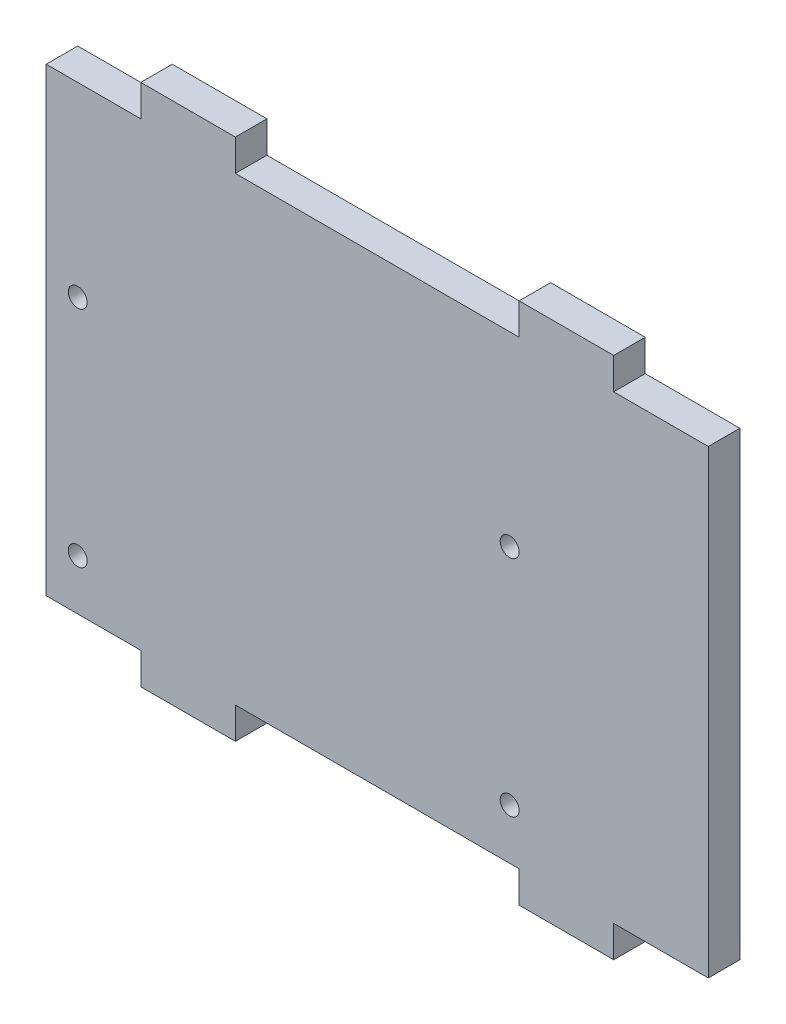
ISO-10303-21;
HEADER;
FILE_DESCRIPTION(('STEP AP214'),'2;1');
FILE_NAME('part.step','',(''),(''),'','','');
FILE_SCHEMA(('AUTOMOTIVE_DESIGN { 1 0 10303 214 1 1 1 1 }'));
ENDSEC;
DATA;
#1=APPLICATION_CONTEXT('core data for automotive mechanical design processes');
#2=APPLICATION_PROTOCOL_DEFINITION('international standard','automotive_design',2000,#1);
#3=PRODUCT_CONTEXT('',#1,'mechanical');
#4=PRODUCT('Part','Part','',(#3));
#5=PRODUCT_RELATED_PRODUCT_CATEGORY('part','',(#4));
#6=PRODUCT_DEFINITION_FORMATION('','',#4);
#7=PRODUCT_DEFINITION_CONTEXT('part definition',#1,'design');
#8=PRODUCT_DEFINITION('design','',#6,#7);
#9=PRODUCT_DEFINITION_SHAPE('','',#8);
#10=(LENGTH_UNIT() NAMED_UNIT(*) SI_UNIT(.MILLI.,.METRE.));
#11=(NAMED_UNIT(*) PLANE_ANGLE_UNIT() SI_UNIT($,.RADIAN.));
#12=(NAMED_UNIT(*) SI_UNIT($,.STERADIAN.) SOLID_ANGLE_UNIT());
#13=UNCERTAINTY_MEASURE_WITH_UNIT(LENGTH_MEASURE(1.E-05),#10,'distance_accuracy_value','');
#14=(GEOMETRIC_REPRESENTATION_CONTEXT(3) GLOBAL_UNCERTAINTY_ASSIGNED_CONTEXT((#13)) GLOBAL_UNIT_ASSIGNED_CONTEXT((#10,
#11,#12)) REPRESENTATION_CONTEXT('',''));
#15=CARTESIAN_POINT('',(0.,0.,0.));
#16=DIRECTION('',(0.,0.,1.));
#17=DIRECTION('',(1.,0.,0.));
#18=AXIS2_PLACEMENT_3D('',#15,#16,#17);
#19=CARTESIAN_POINT('',(-174.858209676586,152.05914501331,5.));
#20=DIRECTION('',(0.,-1.,0.));
#21=DIRECTION('',(0.,0.,-1.));
#22=AXIS2_PLACEMENT_3D('',#19,#20,#21);
#23=PLANE('',#22);
#24=DIRECTION('',(-1.,0.,0.));
#25=VECTOR('',#24,1.);
#26=CARTESIAN_POINT('',(-174.858209676586,152.05914501331,5.));
#27=LINE('',#26,#25);
#28=CARTESIAN_POINT('',(-159.858209676586,152.05914501331,5.));
#29=VERTEX_POINT('',#28);
#30=CARTESIAN_POINT('',(-174.858209676586,152.05914501331,5.));
#31=VERTEX_POINT('',#30);
#32=EDGE_CURVE('E37',#29,#31,#27,.T.);
#33=ORIENTED_EDGE('',*,*,#32,.F.);
#34=DIRECTION('',(0.,0.,1.));
#35=VECTOR('',#34,1.);
#36=CARTESIAN_POINT('',(-159.858209676586,152.05914501331,0.));
#37=LINE('',#36,#35);
#38=CARTESIAN_POINT('',(-159.858209676586,152.05914501331,0.));
#39=VERTEX_POINT('',#38);
#40=EDGE_CURVE('E206',#39,#29,#37,.T.);
#41=ORIENTED_EDGE('',*,*,#40,.F.);
#42=DIRECTION('',(-1.,0.,0.));
#43=VECTOR('',#42,1.);
#44=CARTESIAN_POINT('',(-174.858209676586,152.05914501331,0.));
#45=LINE('',#44,#43);
#46=CARTESIAN_POINT('',(-174.858209676586,152.05914501331,0.));
#47=VERTEX_POINT('',#46);
#48=EDGE_CURVE('E238',#39,#47,#45,.T.);
#49=ORIENTED_EDGE('',*,*,#48,.T.);
#50=DIRECTION('',(0.,0.,-1.));
#51=VECTOR('',#50,1.);
#52=CARTESIAN_POINT('',(-174.858209676586,152.05914501331,5.));
#53=LINE('',#52,#51);
#54=EDGE_CURVE('E246',#31,#47,#53,.T.);
#55=ORIENTED_EDGE('',*,*,#54,.F.);
#56=EDGE_LOOP('',(#33,#41,#49,#55));
#57=FACE_BOUND('',#56,.T.);
#58=ADVANCED_FACE('F33',(#57),#23,.F.);
#59=CARTESIAN_POINT('',(-99.8582096765858,152.05914501331,0.));
#60=VERTEX_POINT('',#59);
#61=CARTESIAN_POINT('',(-144.858209676586,152.05914501331,0.));
#62=VERTEX_POINT('',#61);
#63=EDGE_CURVE('E240',#60,#62,#45,.T.);
#64=ORIENTED_EDGE('',*,*,#63,.T.);
#65=DIRECTION('',(0.,0.,1.));
#66=VECTOR('',#65,1.);
#67=CARTESIAN_POINT('',(-144.858209676586,152.05914501331,0.));
#68=LINE('',#67,#66);
#69=CARTESIAN_POINT('',(-144.858209676586,152.05914501331,5.));
#70=VERTEX_POINT('',#69);
#71=EDGE_CURVE('E58',#62,#70,#68,.T.);
#72=ORIENTED_EDGE('',*,*,#71,.T.);
#73=CARTESIAN_POINT('',(-99.8582096765858,152.05914501331,5.));
#74=VERTEX_POINT('',#73);
#75=EDGE_CURVE('E290',#74,#70,#27,.T.);
#76=ORIENTED_EDGE('',*,*,#75,.F.);
#77=DIRECTION('',(0.,0.,1.));
#78=VECTOR('',#77,1.);
#79=CARTESIAN_POINT('',(-99.8582096765858,152.05914501331,0.));
#80=LINE('',#79,#78);
#81=EDGE_CURVE('E225',#60,#74,#80,.T.);
#82=ORIENTED_EDGE('',*,*,#81,.F.);
#83=EDGE_LOOP('',(#64,#72,#76,#82));
#84=FACE_BOUND('',#83,.T.);
#85=ADVANCED_FACE('F435',(#84),#23,.F.);
#86=CARTESIAN_POINT('',(-174.858209676586,79.0591450133095,5.));
#87=DIRECTION('',(0.,1.,0.));
#88=DIRECTION('',(0.,0.,1.));
#89=AXIS2_PLACEMENT_3D('',#86,#87,#88);
#90=PLANE('',#89);
#91=DIRECTION('',(1.,0.,0.));
#92=VECTOR('',#91,1.);
#93=CARTESIAN_POINT('',(-174.858209676586,79.0591450133095,0.));
#94=LINE('',#93,#92);
#95=CARTESIAN_POINT('',(-144.858209676586,79.0591450133095,0.));
#96=VERTEX_POINT('',#95);
#97=CARTESIAN_POINT('',(-99.8582096765858,79.0591450133095,0.));
#98=VERTEX_POINT('',#97);
#99=EDGE_CURVE('E276',#96,#98,#94,.T.);
#100=ORIENTED_EDGE('',*,*,#99,.T.);
#101=DIRECTION('',(0.,0.,1.));
#102=VECTOR('',#101,1.);
#103=CARTESIAN_POINT('',(-99.8582096765858,79.0591450133095,0.));
#104=LINE('',#103,#102);
#105=CARTESIAN_POINT('',(-99.8582096765858,79.0591450133095,5.));
#106=VERTEX_POINT('',#105);
#107=EDGE_CURVE('E341',#98,#106,#104,.T.);
#108=ORIENTED_EDGE('',*,*,#107,.T.);
#109=DIRECTION('',(1.,0.,0.));
#110=VECTOR('',#109,1.);
#111=CARTESIAN_POINT('',(-174.858209676586,79.0591450133095,5.));
#112=LINE('',#111,#110);
#113=CARTESIAN_POINT('',(-144.858209676586,79.0591450133095,5.));
#114=VERTEX_POINT('',#113);
#115=EDGE_CURVE('E260',#114,#106,#112,.T.);
#116=ORIENTED_EDGE('',*,*,#115,.F.);
#117=DIRECTION('',(0.,0.,1.));
#118=VECTOR('',#117,1.);
#119=CARTESIAN_POINT('',(-144.858209676586,79.0591450133095,0.));
#120=LINE('',#119,#118);
#121=EDGE_CURVE('E369',#96,#114,#120,.T.);
#122=ORIENTED_EDGE('',*,*,#121,.F.);
#123=EDGE_LOOP('',(#100,#108,#116,#122));
#124=FACE_BOUND('',#123,.T.);
#125=ADVANCED_FACE('F392',(#124),#90,.F.);
#126=CARTESIAN_POINT('',(-84.8582096765858,79.0591450133095,5.));
#127=VERTEX_POINT('',#126);
#128=CARTESIAN_POINT('',(-69.8582096765858,79.0591450133095,5.));
#129=VERTEX_POINT('',#128);
#130=EDGE_CURVE('E257',#127,#129,#112,.T.);
#131=ORIENTED_EDGE('',*,*,#130,.F.);
#132=DIRECTION('',(0.,0.,1.));
#133=VECTOR('',#132,1.);
#134=CARTESIAN_POINT('',(-84.8582096765858,79.0591450133095,0.));
#135=LINE('',#134,#133);
#136=CARTESIAN_POINT('',(-84.8582096765858,79.0591450133095,0.));
#137=VERTEX_POINT('',#136);
#138=EDGE_CURVE('E344',#137,#127,#135,.T.);
#139=ORIENTED_EDGE('',*,*,#138,.F.);
#140=CARTESIAN_POINT('',(-69.8582096765858,79.0591450133095,0.));
#141=VERTEX_POINT('',#140);
#142=EDGE_CURVE('E261',#137,#141,#94,.T.);
#143=ORIENTED_EDGE('',*,*,#142,.T.);
#144=DIRECTION('',(0.,0.,-1.));
#145=VECTOR('',#144,1.);
#146=CARTESIAN_POINT('',(-69.8582096765858,79.0591450133095,5.));
#147=LINE('',#146,#145);
#148=EDGE_CURVE('E43',#129,#141,#147,.T.);
#149=ORIENTED_EDGE('',*,*,#148,.F.);
#150=EDGE_LOOP('',(#131,#139,#143,#149));
#151=FACE_BOUND('',#150,.T.);
#152=ADVANCED_FACE('F409',(#151),#90,.F.);
#153=CARTESIAN_POINT('',(-174.858209676586,152.05914501331,5.));
#154=DIRECTION('',(1.,0.,0.));
#155=DIRECTION('',(0.,0.,-1.));
#156=AXIS2_PLACEMENT_3D('',#153,#154,#155);
#157=PLANE('',#156);
#158=DIRECTION('',(0.,-1.,0.));
#159=VECTOR('',#158,1.);
#160=CARTESIAN_POINT('',(-174.858209676586,152.05914501331,0.));
#161=LINE('',#160,#159);
#162=CARTESIAN_POINT('',(-174.858209676586,79.0591450133095,0.));
#163=VERTEX_POINT('',#162);
#164=EDGE_CURVE('E281',#47,#163,#161,.T.);
#165=ORIENTED_EDGE('',*,*,#164,.T.);
#166=DIRECTION('',(0.,0.,-1.));
#167=VECTOR('',#166,1.);
#168=CARTESIAN_POINT('',(-174.858209676586,79.0591450133095,5.));
#169=LINE('',#168,#167);
#170=CARTESIAN_POINT('',(-174.858209676586,79.0591450133095,5.));
#171=VERTEX_POINT('',#170);
#172=EDGE_CURVE('E11',#171,#163,#169,.T.);
#173=ORIENTED_EDGE('',*,*,#172,.F.);
#174=DIRECTION('',(0.,-1.,0.));
#175=VECTOR('',#174,1.);
#176=CARTESIAN_POINT('',(-174.858209676586,152.05914501331,5.));
#177=LINE('',#176,#175);
#178=EDGE_CURVE('E256',#31,#171,#177,.T.);
#179=ORIENTED_EDGE('',*,*,#178,.F.);
#180=ORIENTED_EDGE('',*,*,#54,.T.);
#181=EDGE_LOOP('',(#165,#173,#179,#180));
#182=FACE_BOUND('',#181,.T.);
#183=ADVANCED_FACE('F35',(#182),#157,.F.);
#184=CARTESIAN_POINT('',(-159.858209676586,79.0591450133095,0.));
#185=VERTEX_POINT('',#184);
#186=EDGE_CURVE('E278',#163,#185,#94,.T.);
#187=ORIENTED_EDGE('',*,*,#186,.T.);
#188=DIRECTION('',(0.,0.,1.));
#189=VECTOR('',#188,1.);
#190=CARTESIAN_POINT('',(-159.858209676586,79.0591450133095,0.));
#191=LINE('',#190,#189);
#192=CARTESIAN_POINT('',(-159.858209676586,79.0591450133095,5.));
#193=VERTEX_POINT('',#192);
#194=EDGE_CURVE('E364',#185,#193,#191,.T.);
#195=ORIENTED_EDGE('',*,*,#194,.T.);
#196=EDGE_CURVE('E273',#171,#193,#112,.T.);
#197=ORIENTED_EDGE('',*,*,#196,.F.);
#198=ORIENTED_EDGE('',*,*,#172,.T.);
#199=EDGE_LOOP('',(#187,#195,#197,#198));
#200=FACE_BOUND('',#199,.T.);
#201=ADVANCED_FACE('F413',(#200),#90,.F.);
#202=CARTESIAN_POINT('',(-69.8582096765858,152.05914501331,5.));
#203=DIRECTION('',(-1.,0.,0.));
#204=DIRECTION('',(0.,-1.,0.));
#205=AXIS2_PLACEMENT_3D('',#202,#203,#204);
#206=PLANE('',#205);
#207=DIRECTION('',(0.,1.,0.));
#208=VECTOR('',#207,1.);
#209=CARTESIAN_POINT('',(-69.8582096765858,152.05914501331,0.));
#210=LINE('',#209,#208);
#211=CARTESIAN_POINT('',(-69.8582096765858,152.05914501331,0.));
#212=VERTEX_POINT('',#211);
#213=EDGE_CURVE('E241',#141,#212,#210,.T.);
#214=ORIENTED_EDGE('',*,*,#213,.T.);
#215=DIRECTION('',(0.,0.,-1.));
#216=VECTOR('',#215,1.);
#217=CARTESIAN_POINT('',(-69.8582096765858,152.05914501331,5.));
#218=LINE('',#217,#216);
#219=CARTESIAN_POINT('',(-69.8582096765858,152.05914501331,5.));
#220=VERTEX_POINT('',#219);
#221=EDGE_CURVE('E298',#220,#212,#218,.T.);
#222=ORIENTED_EDGE('',*,*,#221,.F.);
#223=DIRECTION('',(0.,1.,0.));
#224=VECTOR('',#223,1.);
#225=CARTESIAN_POINT('',(-69.8582096765858,152.05914501331,5.));
#226=LINE('',#225,#224);
#227=EDGE_CURVE('E267',#129,#220,#226,.T.);
#228=ORIENTED_EDGE('',*,*,#227,.F.);
#229=ORIENTED_EDGE('',*,*,#148,.T.);
#230=EDGE_LOOP('',(#214,#222,#228,#229));
#231=FACE_BOUND('',#230,.T.);
#232=ADVANCED_FACE('F308',(#231),#206,.F.);
#233=CARTESIAN_POINT('',(-84.8582096765858,152.05914501331,0.));
#234=VERTEX_POINT('',#233);
#235=EDGE_CURVE('E253',#212,#234,#45,.T.);
#236=ORIENTED_EDGE('',*,*,#235,.T.);
#237=DIRECTION('',(0.,0.,1.));
#238=VECTOR('',#237,1.);
#239=CARTESIAN_POINT('',(-84.8582096765858,152.05914501331,0.));
#240=LINE('',#239,#238);
#241=CARTESIAN_POINT('',(-84.8582096765858,152.05914501331,5.));
#242=VERTEX_POINT('',#241);
#243=EDGE_CURVE('E232',#234,#242,#240,.T.);
#244=ORIENTED_EDGE('',*,*,#243,.T.);
#245=EDGE_CURVE('E292',#220,#242,#27,.T.);
#246=ORIENTED_EDGE('',*,*,#245,.F.);
#247=ORIENTED_EDGE('',*,*,#221,.T.);
#248=EDGE_LOOP('',(#236,#244,#246,#247));
#249=FACE_BOUND('',#248,.T.);
#250=ADVANCED_FACE('F313',(#249),#23,.F.);
#251=CARTESIAN_POINT('',(0.,0.,5.));
#252=DIRECTION('',(0.,0.,1.));
#253=DIRECTION('',(1.,0.,0.));
#254=AXIS2_PLACEMENT_3D('',#251,#252,#253);
#255=PLANE('',#254);
#256=CARTESIAN_POINT('',(-101.358209676586,87.0591450133095,5.));
#257=DIRECTION('',(0.,0.,1.));
#258=DIRECTION('',(1.,0.,0.));
#259=AXIS2_PLACEMENT_3D('',#256,#257,#258);
#260=CIRCLE('',#259,1.49999999999998);
#261=CARTESIAN_POINT('',(-99.8582096765858,87.0591450133095,5.));
#262=VERTEX_POINT('',#261);
#263=EDGE_CURVE('E368',#262,#262,#260,.T.);
#264=ORIENTED_EDGE('',*,*,#263,.F.);
#265=EDGE_LOOP('',(#264));
#266=FACE_BOUND('',#265,.T.);
#267=CARTESIAN_POINT('',(-169.858209676586,87.0591450133095,5.));
#268=DIRECTION('',(0.,0.,1.));
#269=DIRECTION('',(1.,0.,0.));
#270=AXIS2_PLACEMENT_3D('',#267,#268,#269);
#271=CIRCLE('',#270,1.5);
#272=CARTESIAN_POINT('',(-168.358209676586,87.0591450133095,5.));
#273=VERTEX_POINT('',#272);
#274=EDGE_CURVE('E601',#273,#273,#271,.T.);
#275=ORIENTED_EDGE('',*,*,#274,.F.);
#276=EDGE_LOOP('',(#275));
#277=FACE_BOUND('',#276,.T.);
#278=CARTESIAN_POINT('',(-169.858209676586,122.55914501331,5.));
#279=DIRECTION('',(0.,0.,1.));
#280=DIRECTION('',(1.,0.,0.));
#281=AXIS2_PLACEMENT_3D('',#278,#279,#280);
#282=CIRCLE('',#281,1.5);
#283=CARTESIAN_POINT('',(-168.358209676586,122.55914501331,5.));
#284=VERTEX_POINT('',#283);
#285=EDGE_CURVE('E595',#284,#284,#282,.T.);
#286=ORIENTED_EDGE('',*,*,#285,.F.);
#287=EDGE_LOOP('',(#286));
#288=FACE_BOUND('',#287,.T.);
#289=CARTESIAN_POINT('',(-101.358209676586,122.55914501331,5.));
#290=DIRECTION('',(0.,0.,1.));
#291=DIRECTION('',(1.,0.,0.));
#292=AXIS2_PLACEMENT_3D('',#289,#290,#291);
#293=CIRCLE('',#292,1.49999999999998);
#294=CARTESIAN_POINT('',(-99.8582096765858,122.55914501331,5.));
#295=VERTEX_POINT('',#294);
#296=EDGE_CURVE('E590',#295,#295,#293,.T.);
#297=ORIENTED_EDGE('',*,*,#296,.F.);
#298=EDGE_LOOP('',(#297));
#299=FACE_BOUND('',#298,.T.);
#300=ORIENTED_EDGE('',*,*,#178,.T.);
#301=ORIENTED_EDGE('',*,*,#196,.T.);
#302=DIRECTION('',(0.,-1.,0.));
#303=VECTOR('',#302,1.);
#304=CARTESIAN_POINT('',(-159.858209676586,79.0591450133095,5.));
#305=LINE('',#304,#303);
#306=CARTESIAN_POINT('',(-159.858209676586,74.0591450133096,5.));
#307=VERTEX_POINT('',#306);
#308=EDGE_CURVE('E343',#193,#307,#305,.T.);
#309=ORIENTED_EDGE('',*,*,#308,.T.);
#310=DIRECTION('',(1.,0.,0.));
#311=VECTOR('',#310,1.);
#312=CARTESIAN_POINT('',(-159.858209676586,74.0591450133096,5.));
#313=LINE('',#312,#311);
#314=CARTESIAN_POINT('',(-144.858209676586,74.0591450133096,5.));
#315=VERTEX_POINT('',#314);
#316=EDGE_CURVE('E355',#307,#315,#313,.T.);
#317=ORIENTED_EDGE('',*,*,#316,.T.);
#318=DIRECTION('',(0.,1.,0.));
#319=VECTOR('',#318,1.);
#320=CARTESIAN_POINT('',(-144.858209676586,79.0591450133095,5.));
#321=LINE('',#320,#319);
#322=EDGE_CURVE('E358',#315,#114,#321,.T.);
#323=ORIENTED_EDGE('',*,*,#322,.T.);
#324=ORIENTED_EDGE('',*,*,#115,.T.);
#325=DIRECTION('',(0.,-1.,0.));
#326=VECTOR('',#325,1.);
#327=CARTESIAN_POINT('',(-99.8582096765858,79.0591450133095,5.));
#328=LINE('',#327,#326);
#329=CARTESIAN_POINT('',(-99.8582096765858,74.0591450133096,5.));
#330=VERTEX_POINT('',#329);
#331=EDGE_CURVE('E228',#106,#330,#328,.T.);
#332=ORIENTED_EDGE('',*,*,#331,.T.);
#333=DIRECTION('',(1.,0.,0.));
#334=VECTOR('',#333,1.);
#335=CARTESIAN_POINT('',(-99.8582096765858,74.0591450133096,5.));
#336=LINE('',#335,#334);
#337=CARTESIAN_POINT('',(-84.8582096765858,74.0591450133096,5.));
#338=VERTEX_POINT('',#337);
#339=EDGE_CURVE('E337',#330,#338,#336,.T.);
#340=ORIENTED_EDGE('',*,*,#339,.T.);
#341=DIRECTION('',(0.,1.,0.));
#342=VECTOR('',#341,1.);
#343=CARTESIAN_POINT('',(-84.8582096765858,79.0591450133095,5.));
#344=LINE('',#343,#342);
#345=EDGE_CURVE('E328',#338,#127,#344,.T.);
#346=ORIENTED_EDGE('',*,*,#345,.T.);
#347=ORIENTED_EDGE('',*,*,#130,.T.);
#348=ORIENTED_EDGE('',*,*,#227,.T.);
#349=ORIENTED_EDGE('',*,*,#245,.T.);
#350=DIRECTION('',(0.,1.,0.));
#351=VECTOR('',#350,1.);
#352=CARTESIAN_POINT('',(-84.8582096765858,152.05914501331,5.));
#353=LINE('',#352,#351);
#354=CARTESIAN_POINT('',(-84.8582096765858,157.059145013309,5.));
#355=VERTEX_POINT('',#354);
#356=EDGE_CURVE('E208',#242,#355,#353,.T.);
#357=ORIENTED_EDGE('',*,*,#356,.T.);
#358=DIRECTION('',(-1.,0.,0.));
#359=VECTOR('',#358,1.);
#360=CARTESIAN_POINT('',(-99.8582096765858,157.059145013309,5.));
#361=LINE('',#360,#359);
#362=CARTESIAN_POINT('',(-99.8582096765858,157.059145013309,5.));
#363=VERTEX_POINT('',#362);
#364=EDGE_CURVE('E216',#355,#363,#361,.T.);
#365=ORIENTED_EDGE('',*,*,#364,.T.);
#366=DIRECTION('',(0.,-1.,0.));
#367=VECTOR('',#366,1.);
#368=CARTESIAN_POINT('',(-99.8582096765858,152.05914501331,5.));
#369=LINE('',#368,#367);
#370=EDGE_CURVE('E219',#363,#74,#369,.T.);
#371=ORIENTED_EDGE('',*,*,#370,.T.);
#372=ORIENTED_EDGE('',*,*,#75,.T.);
#373=DIRECTION('',(0.,1.,0.));
#374=VECTOR('',#373,1.);
#375=CARTESIAN_POINT('',(-144.858209676586,152.05914501331,5.));
#376=LINE('',#375,#374);
#377=CARTESIAN_POINT('',(-144.858209676586,157.059145013309,5.));
#378=VERTEX_POINT('',#377);
#379=EDGE_CURVE('E203',#70,#378,#376,.T.);
#380=ORIENTED_EDGE('',*,*,#379,.T.);
#381=DIRECTION('',(-1.,0.,0.));
#382=VECTOR('',#381,1.);
#383=CARTESIAN_POINT('',(-159.858209676586,157.059145013309,5.));
#384=LINE('',#383,#382);
#385=CARTESIAN_POINT('',(-159.858209676586,157.059145013309,5.));
#386=VERTEX_POINT('',#385);
#387=EDGE_CURVE('E180',#378,#386,#384,.T.);
#388=ORIENTED_EDGE('',*,*,#387,.T.);
#389=DIRECTION('',(0.,-1.,0.));
#390=VECTOR('',#389,1.);
#391=CARTESIAN_POINT('',(-159.858209676586,152.05914501331,5.));
#392=LINE('',#391,#390);
#393=EDGE_CURVE('E197',#386,#29,#392,.T.);
#394=ORIENTED_EDGE('',*,*,#393,.T.);
#395=ORIENTED_EDGE('',*,*,#32,.T.);
#396=EDGE_LOOP('',(#300,#301,#309,#317,#323,#324,#332,#340,#346,#347,#348,#349,#357,#365,#371,
#372,#380,#388,#394,#395));
#397=FACE_BOUND('',#396,.T.);
#398=ADVANCED_FACE('F302',(#266,#277,#288,#299,#397),#255,.T.);
#399=CARTESIAN_POINT('',(0.,0.,0.));
#400=DIRECTION('',(0.,0.,1.));
#401=DIRECTION('',(1.,0.,0.));
#402=AXIS2_PLACEMENT_3D('',#399,#400,#401);
#403=PLANE('',#402);
#404=CARTESIAN_POINT('',(-101.358209676586,87.0591450133095,0.));
#405=DIRECTION('',(0.,0.,1.));
#406=DIRECTION('',(1.,0.,0.));
#407=AXIS2_PLACEMENT_3D('',#404,#405,#406);
#408=CIRCLE('',#407,1.49999999999998);
#409=CARTESIAN_POINT('',(-99.8582096765858,87.0591450133095,0.));
#410=VERTEX_POINT('',#409);
#411=EDGE_CURVE('E604',#410,#410,#408,.T.);
#412=ORIENTED_EDGE('',*,*,#411,.T.);
#413=EDGE_LOOP('',(#412));
#414=FACE_BOUND('',#413,.T.);
#415=CARTESIAN_POINT('',(-169.858209676586,87.0591450133095,0.));
#416=DIRECTION('',(0.,0.,1.));
#417=DIRECTION('',(1.,0.,0.));
#418=AXIS2_PLACEMENT_3D('',#415,#416,#417);
#419=CIRCLE('',#418,1.5);
#420=CARTESIAN_POINT('',(-168.358209676586,87.0591450133095,0.));
#421=VERTEX_POINT('',#420);
#422=EDGE_CURVE('E599',#421,#421,#419,.T.);
#423=ORIENTED_EDGE('',*,*,#422,.T.);
#424=EDGE_LOOP('',(#423));
#425=FACE_BOUND('',#424,.T.);
#426=CARTESIAN_POINT('',(-169.858209676586,122.55914501331,0.));
#427=DIRECTION('',(0.,0.,1.));
#428=DIRECTION('',(1.,0.,0.));
#429=AXIS2_PLACEMENT_3D('',#426,#427,#428);
#430=CIRCLE('',#429,1.5);
#431=CARTESIAN_POINT('',(-168.358209676586,122.55914501331,0.));
#432=VERTEX_POINT('',#431);
#433=EDGE_CURVE('E592',#432,#432,#430,.T.);
#434=ORIENTED_EDGE('',*,*,#433,.T.);
#435=EDGE_LOOP('',(#434));
#436=FACE_BOUND('',#435,.T.);
#437=CARTESIAN_POINT('',(-101.358209676586,122.55914501331,0.));
#438=DIRECTION('',(0.,0.,1.));
#439=DIRECTION('',(1.,0.,0.));
#440=AXIS2_PLACEMENT_3D('',#437,#438,#439);
#441=CIRCLE('',#440,1.49999999999998);
#442=CARTESIAN_POINT('',(-99.8582096765858,122.55914501331,0.));
#443=VERTEX_POINT('',#442);
#444=EDGE_CURVE('E285',#443,#443,#441,.T.);
#445=ORIENTED_EDGE('',*,*,#444,.T.);
#446=EDGE_LOOP('',(#445));
#447=FACE_BOUND('',#446,.T.);
#448=ORIENTED_EDGE('',*,*,#164,.F.);
#449=ORIENTED_EDGE('',*,*,#48,.F.);
#450=DIRECTION('',(0.,-1.,0.));
#451=VECTOR('',#450,1.);
#452=CARTESIAN_POINT('',(-159.858209676586,152.05914501331,0.));
#453=LINE('',#452,#451);
#454=CARTESIAN_POINT('',(-159.858209676586,157.059145013309,0.));
#455=VERTEX_POINT('',#454);
#456=EDGE_CURVE('E194',#455,#39,#453,.T.);
#457=ORIENTED_EDGE('',*,*,#456,.F.);
#458=DIRECTION('',(-1.,0.,0.));
#459=VECTOR('',#458,1.);
#460=CARTESIAN_POINT('',(-159.858209676586,157.059145013309,0.));
#461=LINE('',#460,#459);
#462=CARTESIAN_POINT('',(-144.858209676586,157.059145013309,0.));
#463=VERTEX_POINT('',#462);
#464=EDGE_CURVE('E177',#463,#455,#461,.T.);
#465=ORIENTED_EDGE('',*,*,#464,.F.);
#466=DIRECTION('',(0.,1.,0.));
#467=VECTOR('',#466,1.);
#468=CARTESIAN_POINT('',(-144.858209676586,152.05914501331,0.));
#469=LINE('',#468,#467);
#470=EDGE_CURVE('E192',#62,#463,#469,.T.);
#471=ORIENTED_EDGE('',*,*,#470,.F.);
#472=ORIENTED_EDGE('',*,*,#63,.F.);
#473=DIRECTION('',(0.,-1.,0.));
#474=VECTOR('',#473,1.);
#475=CARTESIAN_POINT('',(-99.8582096765858,152.05914501331,0.));
#476=LINE('',#475,#474);
#477=CARTESIAN_POINT('',(-99.8582096765858,157.059145013309,0.));
#478=VERTEX_POINT('',#477);
#479=EDGE_CURVE('E214',#478,#60,#476,.T.);
#480=ORIENTED_EDGE('',*,*,#479,.F.);
#481=DIRECTION('',(-1.,0.,0.));
#482=VECTOR('',#481,1.);
#483=CARTESIAN_POINT('',(-99.8582096765858,157.059145013309,0.));
#484=LINE('',#483,#482);
#485=CARTESIAN_POINT('',(-84.8582096765858,157.059145013309,0.));
#486=VERTEX_POINT('',#485);
#487=EDGE_CURVE('E211',#486,#478,#484,.T.);
#488=ORIENTED_EDGE('',*,*,#487,.F.);
#489=DIRECTION('',(0.,1.,0.));
#490=VECTOR('',#489,1.);
#491=CARTESIAN_POINT('',(-84.8582096765858,152.05914501331,0.));
#492=LINE('',#491,#490);
#493=EDGE_CURVE('E215',#234,#486,#492,.T.);
#494=ORIENTED_EDGE('',*,*,#493,.F.);
#495=ORIENTED_EDGE('',*,*,#235,.F.);
#496=ORIENTED_EDGE('',*,*,#213,.F.);
#497=ORIENTED_EDGE('',*,*,#142,.F.);
#498=DIRECTION('',(0.,1.,0.));
#499=VECTOR('',#498,1.);
#500=CARTESIAN_POINT('',(-84.8582096765858,79.0591450133095,0.));
#501=LINE('',#500,#499);
#502=CARTESIAN_POINT('',(-84.8582096765858,74.0591450133096,0.));
#503=VERTEX_POINT('',#502);
#504=EDGE_CURVE('E331',#503,#137,#501,.T.);
#505=ORIENTED_EDGE('',*,*,#504,.F.);
#506=DIRECTION('',(1.,0.,0.));
#507=VECTOR('',#506,1.);
#508=CARTESIAN_POINT('',(-99.8582096765858,74.0591450133096,0.));
#509=LINE('',#508,#507);
#510=CARTESIAN_POINT('',(-99.8582096765858,74.0591450133096,0.));
#511=VERTEX_POINT('',#510);
#512=EDGE_CURVE('E327',#511,#503,#509,.T.);
#513=ORIENTED_EDGE('',*,*,#512,.F.);
#514=DIRECTION('',(0.,-1.,0.));
#515=VECTOR('',#514,1.);
#516=CARTESIAN_POINT('',(-99.8582096765858,79.0591450133095,0.));
#517=LINE('',#516,#515);
#518=EDGE_CURVE('E324',#98,#511,#517,.T.);
#519=ORIENTED_EDGE('',*,*,#518,.F.);
#520=ORIENTED_EDGE('',*,*,#99,.F.);
#521=DIRECTION('',(0.,1.,0.));
#522=VECTOR('',#521,1.);
#523=CARTESIAN_POINT('',(-144.858209676586,79.0591450133095,0.));
#524=LINE('',#523,#522);
#525=CARTESIAN_POINT('',(-144.858209676586,74.0591450133096,0.));
#526=VERTEX_POINT('',#525);
#527=EDGE_CURVE('E353',#526,#96,#524,.T.);
#528=ORIENTED_EDGE('',*,*,#527,.F.);
#529=DIRECTION('',(1.,0.,0.));
#530=VECTOR('',#529,1.);
#531=CARTESIAN_POINT('',(-159.858209676586,74.0591450133096,0.));
#532=LINE('',#531,#530);
#533=CARTESIAN_POINT('',(-159.858209676586,74.0591450133096,0.));
#534=VERTEX_POINT('',#533);
#535=EDGE_CURVE('E350',#534,#526,#532,.T.);
#536=ORIENTED_EDGE('',*,*,#535,.F.);
#537=DIRECTION('',(0.,-1.,0.));
#538=VECTOR('',#537,1.);
#539=CARTESIAN_POINT('',(-159.858209676586,79.0591450133095,0.));
#540=LINE('',#539,#538);
#541=EDGE_CURVE('E354',#185,#534,#540,.T.);
#542=ORIENTED_EDGE('',*,*,#541,.F.);
#543=ORIENTED_EDGE('',*,*,#186,.F.);
#544=EDGE_LOOP('',(#448,#449,#457,#465,#471,#472,#480,#488,#494,#495,#496,#497,#505,#513,#519,
#520,#528,#536,#542,#543));
#545=FACE_BOUND('',#544,.T.);
#546=ADVANCED_FACE('F190',(#414,#425,#436,#447,#545),#403,.F.);
#547=CARTESIAN_POINT('',(-101.358209676586,122.55914501331,0.));
#548=DIRECTION('',(0.,0.,1.));
#549=DIRECTION('',(1.,0.,0.));
#550=AXIS2_PLACEMENT_3D('',#547,#548,#549);
#551=CYLINDRICAL_SURFACE('',#550,1.49999999999998);
#552=ORIENTED_EDGE('',*,*,#444,.F.);
#553=EDGE_LOOP('',(#552));
#554=FACE_BOUND('',#553,.T.);
#555=ORIENTED_EDGE('',*,*,#296,.T.);
#556=EDGE_LOOP('',(#555));
#557=FACE_BOUND('',#556,.T.);
#558=ADVANCED_FACE('F488',(#554,#557),#551,.F.);
#559=CARTESIAN_POINT('',(-169.858209676586,122.55914501331,0.));
#560=DIRECTION('',(0.,0.,1.));
#561=DIRECTION('',(1.,0.,0.));
#562=AXIS2_PLACEMENT_3D('',#559,#560,#561);
#563=CYLINDRICAL_SURFACE('',#562,1.5);
#564=ORIENTED_EDGE('',*,*,#433,.F.);
#565=EDGE_LOOP('',(#564));
#566=FACE_BOUND('',#565,.T.);
#567=ORIENTED_EDGE('',*,*,#285,.T.);
#568=EDGE_LOOP('',(#567));
#569=FACE_BOUND('',#568,.T.);
#570=ADVANCED_FACE('F576',(#566,#569),#563,.F.);
#571=CARTESIAN_POINT('',(-169.858209676586,87.0591450133095,0.));
#572=DIRECTION('',(0.,0.,1.));
#573=DIRECTION('',(1.,0.,0.));
#574=AXIS2_PLACEMENT_3D('',#571,#572,#573);
#575=CYLINDRICAL_SURFACE('',#574,1.5);
#576=ORIENTED_EDGE('',*,*,#422,.F.);
#577=EDGE_LOOP('',(#576));
#578=FACE_BOUND('',#577,.T.);
#579=ORIENTED_EDGE('',*,*,#274,.T.);
#580=EDGE_LOOP('',(#579));
#581=FACE_BOUND('',#580,.T.);
#582=ADVANCED_FACE('F572',(#578,#581),#575,.F.);
#583=CARTESIAN_POINT('',(-101.358209676586,87.0591450133095,0.));
#584=DIRECTION('',(0.,0.,1.));
#585=DIRECTION('',(1.,0.,0.));
#586=AXIS2_PLACEMENT_3D('',#583,#584,#585);
#587=CYLINDRICAL_SURFACE('',#586,1.49999999999998);
#588=ORIENTED_EDGE('',*,*,#411,.F.);
#589=EDGE_LOOP('',(#588));
#590=FACE_BOUND('',#589,.T.);
#591=ORIENTED_EDGE('',*,*,#263,.T.);
#592=EDGE_LOOP('',(#591));
#593=FACE_BOUND('',#592,.T.);
#594=ADVANCED_FACE('F496',(#590,#593),#587,.F.);
#595=CARTESIAN_POINT('',(-159.858209676586,79.0591450133095,0.));
#596=DIRECTION('',(-1.,0.,0.));
#597=DIRECTION('',(0.,0.,1.));
#598=AXIS2_PLACEMENT_3D('',#595,#596,#597);
#599=PLANE('',#598);
#600=ORIENTED_EDGE('',*,*,#308,.F.);
#601=ORIENTED_EDGE('',*,*,#194,.F.);
#602=ORIENTED_EDGE('',*,*,#541,.T.);
#603=DIRECTION('',(0.,0.,1.));
#604=VECTOR('',#603,1.);
#605=CARTESIAN_POINT('',(-159.858209676586,74.0591450133096,0.));
#606=LINE('',#605,#604);
#607=EDGE_CURVE('E378',#534,#307,#606,.T.);
#608=ORIENTED_EDGE('',*,*,#607,.T.);
#609=EDGE_LOOP('',(#600,#601,#602,#608));
#610=FACE_BOUND('',#609,.T.);
#611=ADVANCED_FACE('F418',(#610),#599,.T.);
#612=CARTESIAN_POINT('',(-144.858209676586,79.0591450133095,0.));
#613=DIRECTION('',(1.,0.,0.));
#614=DIRECTION('',(0.,0.,-1.));
#615=AXIS2_PLACEMENT_3D('',#612,#613,#614);
#616=PLANE('',#615);
#617=ORIENTED_EDGE('',*,*,#322,.F.);
#618=DIRECTION('',(0.,0.,1.));
#619=VECTOR('',#618,1.);
#620=CARTESIAN_POINT('',(-144.858209676586,74.0591450133096,0.));
#621=LINE('',#620,#619);
#622=EDGE_CURVE('E376',#526,#315,#621,.T.);
#623=ORIENTED_EDGE('',*,*,#622,.F.);
#624=ORIENTED_EDGE('',*,*,#527,.T.);
#625=ORIENTED_EDGE('',*,*,#121,.T.);
#626=EDGE_LOOP('',(#617,#623,#624,#625));
#627=FACE_BOUND('',#626,.T.);
#628=ADVANCED_FACE('F495',(#627),#616,.T.);
#629=CARTESIAN_POINT('',(-159.858209676586,74.0591450133096,0.));
#630=DIRECTION('',(0.,-1.,0.));
#631=DIRECTION('',(0.,0.,-1.));
#632=AXIS2_PLACEMENT_3D('',#629,#630,#631);
#633=PLANE('',#632);
#634=ORIENTED_EDGE('',*,*,#316,.F.);
#635=ORIENTED_EDGE('',*,*,#607,.F.);
#636=ORIENTED_EDGE('',*,*,#535,.T.);
#637=ORIENTED_EDGE('',*,*,#622,.T.);
#638=EDGE_LOOP('',(#634,#635,#636,#637));
#639=FACE_BOUND('',#638,.T.);
#640=ADVANCED_FACE('F503',(#639),#633,.T.);
#641=CARTESIAN_POINT('',(-99.8582096765858,79.0591450133095,0.));
#642=DIRECTION('',(-1.,0.,0.));
#643=DIRECTION('',(0.,0.,1.));
#644=AXIS2_PLACEMENT_3D('',#641,#642,#643);
#645=PLANE('',#644);
#646=ORIENTED_EDGE('',*,*,#331,.F.);
#647=ORIENTED_EDGE('',*,*,#107,.F.);
#648=ORIENTED_EDGE('',*,*,#518,.T.);
#649=DIRECTION('',(0.,0.,1.));
#650=VECTOR('',#649,1.);
#651=CARTESIAN_POINT('',(-99.8582096765858,74.0591450133096,0.));
#652=LINE('',#651,#650);
#653=EDGE_CURVE('E334',#511,#330,#652,.T.);
#654=ORIENTED_EDGE('',*,*,#653,.T.);
#655=EDGE_LOOP('',(#646,#647,#648,#654));
#656=FACE_BOUND('',#655,.T.);
#657=ADVANCED_FACE('F397',(#656),#645,.T.);
#658=CARTESIAN_POINT('',(-84.8582096765858,79.0591450133095,0.));
#659=DIRECTION('',(1.,0.,0.));
#660=DIRECTION('',(0.,0.,-1.));
#661=AXIS2_PLACEMENT_3D('',#658,#659,#660);
#662=PLANE('',#661);
#663=ORIENTED_EDGE('',*,*,#345,.F.);
#664=DIRECTION('',(0.,0.,1.));
#665=VECTOR('',#664,1.);
#666=CARTESIAN_POINT('',(-84.8582096765858,74.0591450133096,0.));
#667=LINE('',#666,#665);
#668=EDGE_CURVE('E347',#503,#338,#667,.T.);
#669=ORIENTED_EDGE('',*,*,#668,.F.);
#670=ORIENTED_EDGE('',*,*,#504,.T.);
#671=ORIENTED_EDGE('',*,*,#138,.T.);
#672=EDGE_LOOP('',(#663,#669,#670,#671));
#673=FACE_BOUND('',#672,.T.);
#674=ADVANCED_FACE('F406',(#673),#662,.T.);
#675=CARTESIAN_POINT('',(-99.8582096765858,74.0591450133096,0.));
#676=DIRECTION('',(0.,-1.,0.));
#677=DIRECTION('',(0.,0.,-1.));
#678=AXIS2_PLACEMENT_3D('',#675,#676,#677);
#679=PLANE('',#678);
#680=ORIENTED_EDGE('',*,*,#339,.F.);
#681=ORIENTED_EDGE('',*,*,#653,.F.);
#682=ORIENTED_EDGE('',*,*,#512,.T.);
#683=ORIENTED_EDGE('',*,*,#668,.T.);
#684=EDGE_LOOP('',(#680,#681,#682,#683));
#685=FACE_BOUND('',#684,.T.);
#686=ADVANCED_FACE('F403',(#685),#679,.T.);
#687=CARTESIAN_POINT('',(-99.8582096765858,152.05914501331,0.));
#688=DIRECTION('',(-1.,0.,0.));
#689=DIRECTION('',(0.,0.,1.));
#690=AXIS2_PLACEMENT_3D('',#687,#688,#689);
#691=PLANE('',#690);
#692=ORIENTED_EDGE('',*,*,#370,.F.);
#693=DIRECTION('',(0.,0.,1.));
#694=VECTOR('',#693,1.);
#695=CARTESIAN_POINT('',(-99.8582096765858,157.059145013309,0.));
#696=LINE('',#695,#694);
#697=EDGE_CURVE('E222',#478,#363,#696,.T.);
#698=ORIENTED_EDGE('',*,*,#697,.F.);
#699=ORIENTED_EDGE('',*,*,#479,.T.);
#700=ORIENTED_EDGE('',*,*,#81,.T.);
#701=EDGE_LOOP('',(#692,#698,#699,#700));
#702=FACE_BOUND('',#701,.T.);
#703=ADVANCED_FACE('F529',(#702),#691,.T.);
#704=CARTESIAN_POINT('',(-99.8582096765858,157.059145013309,0.));
#705=DIRECTION('',(0.,1.,0.));
#706=DIRECTION('',(0.,0.,1.));
#707=AXIS2_PLACEMENT_3D('',#704,#705,#706);
#708=PLANE('',#707);
#709=ORIENTED_EDGE('',*,*,#364,.F.);
#710=DIRECTION('',(0.,0.,1.));
#711=VECTOR('',#710,1.);
#712=CARTESIAN_POINT('',(-84.8582096765858,157.059145013309,0.));
#713=LINE('',#712,#711);
#714=EDGE_CURVE('E317',#486,#355,#713,.T.);
#715=ORIENTED_EDGE('',*,*,#714,.F.);
#716=ORIENTED_EDGE('',*,*,#487,.T.);
#717=ORIENTED_EDGE('',*,*,#697,.T.);
#718=EDGE_LOOP('',(#709,#715,#716,#717));
#719=FACE_BOUND('',#718,.T.);
#720=ADVANCED_FACE('F432',(#719),#708,.T.);
#721=CARTESIAN_POINT('',(-84.8582096765858,152.05914501331,0.));
#722=DIRECTION('',(1.,0.,0.));
#723=DIRECTION('',(0.,0.,-1.));
#724=AXIS2_PLACEMENT_3D('',#721,#722,#723);
#725=PLANE('',#724);
#726=ORIENTED_EDGE('',*,*,#356,.F.);
#727=ORIENTED_EDGE('',*,*,#243,.F.);
#728=ORIENTED_EDGE('',*,*,#493,.T.);
#729=ORIENTED_EDGE('',*,*,#714,.T.);
#730=EDGE_LOOP('',(#726,#727,#728,#729));
#731=FACE_BOUND('',#730,.T.);
#732=ADVANCED_FACE('F425',(#731),#725,.T.);
#733=CARTESIAN_POINT('',(-159.858209676586,152.05914501331,0.));
#734=DIRECTION('',(-1.,0.,0.));
#735=DIRECTION('',(0.,0.,1.));
#736=AXIS2_PLACEMENT_3D('',#733,#734,#735);
#737=PLANE('',#736);
#738=ORIENTED_EDGE('',*,*,#393,.F.);
#739=DIRECTION('',(0.,0.,1.));
#740=VECTOR('',#739,1.);
#741=CARTESIAN_POINT('',(-159.858209676586,157.059145013309,0.));
#742=LINE('',#741,#740);
#743=EDGE_CURVE('E185',#455,#386,#742,.T.);
#744=ORIENTED_EDGE('',*,*,#743,.F.);
#745=ORIENTED_EDGE('',*,*,#456,.T.);
#746=ORIENTED_EDGE('',*,*,#40,.T.);
#747=EDGE_LOOP('',(#738,#744,#745,#746));
#748=FACE_BOUND('',#747,.T.);
#749=ADVANCED_FACE('F423',(#748),#737,.T.);
#750=CARTESIAN_POINT('',(-159.858209676586,157.059145013309,0.));
#751=DIRECTION('',(0.,1.,0.));
#752=DIRECTION('',(0.,0.,1.));
#753=AXIS2_PLACEMENT_3D('',#750,#751,#752);
#754=PLANE('',#753);
#755=ORIENTED_EDGE('',*,*,#387,.F.);
#756=DIRECTION('',(0.,0.,1.));
#757=VECTOR('',#756,1.);
#758=CARTESIAN_POINT('',(-144.858209676586,157.059145013309,0.));
#759=LINE('',#758,#757);
#760=EDGE_CURVE('E174',#463,#378,#759,.T.);
#761=ORIENTED_EDGE('',*,*,#760,.F.);
#762=ORIENTED_EDGE('',*,*,#464,.T.);
#763=ORIENTED_EDGE('',*,*,#743,.T.);
#764=EDGE_LOOP('',(#755,#761,#762,#763));
#765=FACE_BOUND('',#764,.T.);
#766=ADVANCED_FACE('F176',(#765),#754,.T.);
#767=CARTESIAN_POINT('',(-144.858209676586,152.05914501331,0.));
#768=DIRECTION('',(1.,0.,0.));
#769=DIRECTION('',(0.,0.,-1.));
#770=AXIS2_PLACEMENT_3D('',#767,#768,#769);
#771=PLANE('',#770);
#772=ORIENTED_EDGE('',*,*,#379,.F.);
#773=ORIENTED_EDGE('',*,*,#71,.F.);
#774=ORIENTED_EDGE('',*,*,#470,.T.);
#775=ORIENTED_EDGE('',*,*,#760,.T.);
#776=EDGE_LOOP('',(#772,#773,#774,#775));
#777=FACE_BOUND('',#776,.T.);
#778=ADVANCED_FACE('F196',(#777),#771,.T.);
#779=CLOSED_SHELL('',(#58,#85,#125,#152,#183,#201,#232,#250,#398,#546,#558,#570,#582,#594,#611,
#628,#640,#657,#674,#686,#703,#720,#732,#749,#766,#778));
#780=MANIFOLD_SOLID_BREP('B2',#779);
#781=ADVANCED_BREP_SHAPE_REPRESENTATION('',(#18,#780),#14);
#782=SHAPE_DEFINITION_REPRESENTATION(#9,#781);
ENDSEC;
END-ISO-10303-21;
